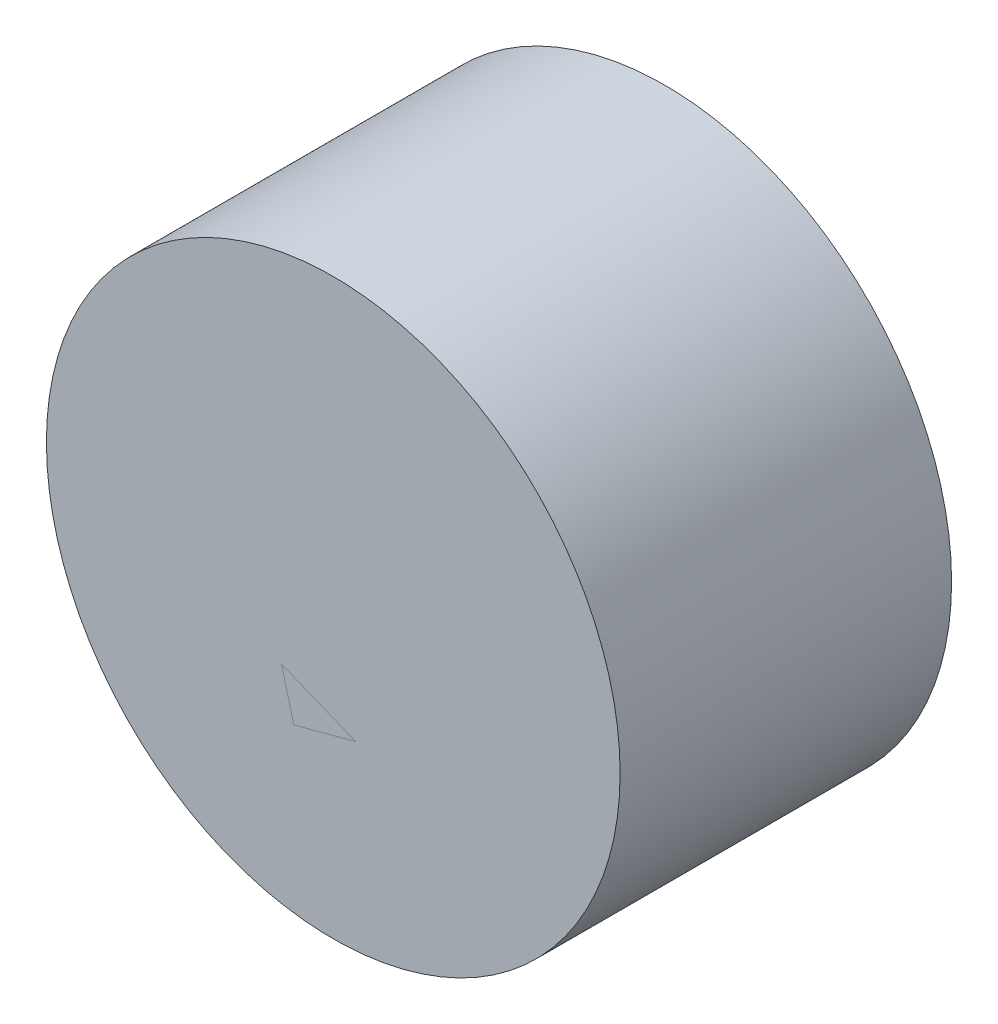
ISO-10303-21;
HEADER;
FILE_DESCRIPTION(('STEP AP214'),'2;1');
FILE_NAME('part.step','',(''),(''),'','','');
FILE_SCHEMA(('AUTOMOTIVE_DESIGN { 1 0 10303 214 1 1 1 1 }'));
ENDSEC;
DATA;
#1=APPLICATION_CONTEXT('core data for automotive mechanical design processes');
#2=APPLICATION_PROTOCOL_DEFINITION('international standard','automotive_design',2000,#1);
#3=PRODUCT_CONTEXT('',#1,'mechanical');
#4=PRODUCT('Part','Part','',(#3));
#5=PRODUCT_RELATED_PRODUCT_CATEGORY('part','',(#4));
#6=PRODUCT_DEFINITION_FORMATION('','',#4);
#7=PRODUCT_DEFINITION_CONTEXT('part definition',#1,'design');
#8=PRODUCT_DEFINITION('design','',#6,#7);
#9=PRODUCT_DEFINITION_SHAPE('','',#8);
#10=(LENGTH_UNIT() NAMED_UNIT(*) SI_UNIT(.MILLI.,.METRE.));
#11=(NAMED_UNIT(*) PLANE_ANGLE_UNIT() SI_UNIT($,.RADIAN.));
#12=(NAMED_UNIT(*) SI_UNIT($,.STERADIAN.) SOLID_ANGLE_UNIT());
#13=UNCERTAINTY_MEASURE_WITH_UNIT(LENGTH_MEASURE(1.E-05),#10,'distance_accuracy_value','');
#14=(GEOMETRIC_REPRESENTATION_CONTEXT(3) GLOBAL_UNCERTAINTY_ASSIGNED_CONTEXT((#13)) GLOBAL_UNIT_ASSIGNED_CONTEXT((#10,
#11,#12)) REPRESENTATION_CONTEXT('',''));
#15=CARTESIAN_POINT('',(0.,0.,0.));
#16=DIRECTION('',(0.,0.,1.));
#17=DIRECTION('',(1.,0.,0.));
#18=AXIS2_PLACEMENT_3D('',#15,#16,#17);
#19=CARTESIAN_POINT('',(-67.8886051914221,-34.8373245008687,4.5));
#20=DIRECTION('',(-0.921643821760074,-0.388036938720381,0.));
#21=DIRECTION('',(0.388036938720381,-0.921643821760074,0.));
#22=AXIS2_PLACEMENT_3D('',#19,#20,#21);
#23=PLANE('',#22);
#24=DIRECTION('',(0.388036938720381,-0.921643821760074,0.));
#25=VECTOR('',#24,1.);
#26=CARTESIAN_POINT('',(-67.8886051914221,-34.8373245008687,13.));
#27=LINE('',#26,#25);
#28=CARTESIAN_POINT('',(-68.3568110489924,-33.7252679081005,13.));
#29=VERTEX_POINT('',#28);
#30=CARTESIAN_POINT('',(-67.8886051914221,-34.8373245008687,13.));
#31=VERTEX_POINT('',#30);
#32=EDGE_CURVE('E108',#29,#31,#27,.T.);
#33=ORIENTED_EDGE('',*,*,#32,.F.);
#34=DIRECTION('',(0.,0.,1.));
#35=VECTOR('',#34,1.);
#36=CARTESIAN_POINT('',(-68.3568110489924,-33.7252679081005,4.5));
#37=LINE('',#36,#35);
#38=CARTESIAN_POINT('',(-68.3568110489924,-33.7252679081005,4.5));
#39=VERTEX_POINT('',#38);
#40=EDGE_CURVE('E12',#39,#29,#37,.T.);
#41=ORIENTED_EDGE('',*,*,#40,.F.);
#42=DIRECTION('',(0.388036938720381,-0.921643821760074,0.));
#43=VECTOR('',#42,1.);
#44=CARTESIAN_POINT('',(-67.8886051914221,-34.8373245008687,4.5));
#45=LINE('',#44,#43);
#46=CARTESIAN_POINT('',(-67.8886051914221,-34.8373245008687,4.5));
#47=VERTEX_POINT('',#46);
#48=EDGE_CURVE('E102',#39,#47,#45,.T.);
#49=ORIENTED_EDGE('',*,*,#48,.T.);
#50=DIRECTION('',(0.,0.,1.));
#51=VECTOR('',#50,1.);
#52=CARTESIAN_POINT('',(-67.8886051914221,-34.8373245008687,4.5));
#53=LINE('',#52,#51);
#54=EDGE_CURVE('E47',#47,#31,#53,.T.);
#55=ORIENTED_EDGE('',*,*,#54,.T.);
#56=EDGE_LOOP('',(#33,#41,#49,#55));
#57=FACE_BOUND('',#56,.T.);
#58=ADVANCED_FACE('F44',(#57),#23,.T.);
#59=CARTESIAN_POINT('',(-62.9737740037809,-32.0963081220779,4.5));
#60=DIRECTION('',(-0.289638748986839,0.957136037920075,0.));
#61=DIRECTION('',(-0.957136037920075,-0.289638748986839,0.));
#62=AXIS2_PLACEMENT_3D('',#59,#60,#61);
#63=PLANE('',#62);
#64=DIRECTION('',(-0.957136037920075,-0.289638748986839,0.));
#65=VECTOR('',#64,1.);
#66=CARTESIAN_POINT('',(-62.9737740037809,-32.0963081220779,13.));
#67=LINE('',#66,#65);
#68=CARTESIAN_POINT('',(-62.9737740037809,-32.0963081220779,13.));
#69=VERTEX_POINT('',#68);
#70=EDGE_CURVE('E104',#69,#29,#67,.T.);
#71=ORIENTED_EDGE('',*,*,#70,.F.);
#72=DIRECTION('',(0.,0.,1.));
#73=VECTOR('',#72,1.);
#74=CARTESIAN_POINT('',(-62.9737740037809,-32.0963081220779,4.5));
#75=LINE('',#74,#73);
#76=CARTESIAN_POINT('',(-62.9737740037809,-32.0963081220779,4.5));
#77=VERTEX_POINT('',#76);
#78=EDGE_CURVE('E53',#77,#69,#75,.T.);
#79=ORIENTED_EDGE('',*,*,#78,.F.);
#80=DIRECTION('',(-0.957136037920075,-0.289638748986839,0.));
#81=VECTOR('',#80,1.);
#82=CARTESIAN_POINT('',(-62.9737740037809,-32.0963081220779,4.5));
#83=LINE('',#82,#81);
#84=EDGE_CURVE('E99',#77,#39,#83,.T.);
#85=ORIENTED_EDGE('',*,*,#84,.T.);
#86=ORIENTED_EDGE('',*,*,#40,.T.);
#87=EDGE_LOOP('',(#71,#79,#85,#86));
#88=FACE_BOUND('',#87,.T.);
#89=ADVANCED_FACE('F118',(#88),#63,.T.);
#90=CARTESIAN_POINT('',(-62.6437364065095,-33.2501757850287,4.5));
#91=DIRECTION('',(0.961444424357765,0.274999307037975,0.));
#92=DIRECTION('',(-0.274999307037975,0.961444424357765,0.));
#93=AXIS2_PLACEMENT_3D('',#90,#91,#92);
#94=PLANE('',#93);
#95=DIRECTION('',(-0.274999307037975,0.961444424357765,0.));
#96=VECTOR('',#95,1.);
#97=CARTESIAN_POINT('',(-62.6437364065095,-33.2501757850287,13.));
#98=LINE('',#97,#96);
#99=CARTESIAN_POINT('',(-62.6437364065095,-33.2501757850287,13.));
#100=VERTEX_POINT('',#99);
#101=EDGE_CURVE('E94',#100,#69,#98,.T.);
#102=ORIENTED_EDGE('',*,*,#101,.F.);
#103=DIRECTION('',(0.,0.,1.));
#104=VECTOR('',#103,1.);
#105=CARTESIAN_POINT('',(-62.6437364065095,-33.2501757850287,4.5));
#106=LINE('',#105,#104);
#107=CARTESIAN_POINT('',(-62.6437364065095,-33.2501757850287,4.5));
#108=VERTEX_POINT('',#107);
#109=EDGE_CURVE('E89',#108,#100,#106,.T.);
#110=ORIENTED_EDGE('',*,*,#109,.F.);
#111=DIRECTION('',(-0.274999307037975,0.961444424357765,0.));
#112=VECTOR('',#111,1.);
#113=CARTESIAN_POINT('',(-62.6437364065095,-33.2501757850287,4.5));
#114=LINE('',#113,#112);
#115=EDGE_CURVE('E92',#108,#77,#114,.T.);
#116=ORIENTED_EDGE('',*,*,#115,.T.);
#117=ORIENTED_EDGE('',*,*,#78,.T.);
#118=EDGE_LOOP('',(#102,#110,#116,#117));
#119=FACE_BOUND('',#118,.T.);
#120=ADVANCED_FACE('F91',(#119),#94,.T.);
#121=CARTESIAN_POINT('',(-67.8886051914221,-34.8373245008687,4.5));
#122=DIRECTION('',(0.289638748988038,-0.957136037919712,0.));
#123=DIRECTION('',(0.957136037919712,0.289638748988038,0.));
#124=AXIS2_PLACEMENT_3D('',#121,#122,#123);
#125=PLANE('',#124);
#126=DIRECTION('',(0.957136037919712,0.289638748988038,0.));
#127=VECTOR('',#126,1.);
#128=CARTESIAN_POINT('',(-67.8886051914221,-34.8373245008687,13.));
#129=LINE('',#128,#127);
#130=EDGE_CURVE('E111',#31,#100,#129,.T.);
#131=ORIENTED_EDGE('',*,*,#130,.F.);
#132=ORIENTED_EDGE('',*,*,#54,.F.);
#133=DIRECTION('',(0.957136037919712,0.289638748988038,0.));
#134=VECTOR('',#133,1.);
#135=CARTESIAN_POINT('',(-67.8886051914221,-34.8373245008687,4.5));
#136=LINE('',#135,#134);
#137=EDGE_CURVE('E98',#47,#108,#136,.T.);
#138=ORIENTED_EDGE('',*,*,#137,.T.);
#139=ORIENTED_EDGE('',*,*,#109,.T.);
#140=EDGE_LOOP('',(#131,#132,#138,#139));
#141=FACE_BOUND('',#140,.T.);
#142=ADVANCED_FACE('F101',(#141),#125,.T.);
#143=CARTESIAN_POINT('',(0.,0.,4.5));
#144=DIRECTION('',(0.,0.,1.));
#145=DIRECTION('',(1.,0.,0.));
#146=AXIS2_PLACEMENT_3D('',#143,#144,#145);
#147=PLANE('',#146);
#148=ORIENTED_EDGE('',*,*,#48,.F.);
#149=ORIENTED_EDGE('',*,*,#84,.F.);
#150=ORIENTED_EDGE('',*,*,#115,.F.);
#151=ORIENTED_EDGE('',*,*,#137,.F.);
#152=EDGE_LOOP('',(#148,#149,#150,#151));
#153=FACE_BOUND('',#152,.T.);
#154=ADVANCED_FACE('F97',(#153),#147,.F.);
#155=CARTESIAN_POINT('',(0.,0.,13.));
#156=DIRECTION('',(0.,0.,1.));
#157=DIRECTION('',(1.,0.,0.));
#158=AXIS2_PLACEMENT_3D('',#155,#156,#157);
#159=PLANE('',#158);
#160=ORIENTED_EDGE('',*,*,#32,.T.);
#161=ORIENTED_EDGE('',*,*,#130,.T.);
#162=ORIENTED_EDGE('',*,*,#101,.T.);
#163=ORIENTED_EDGE('',*,*,#70,.T.);
#164=EDGE_LOOP('',(#160,#161,#162,#163));
#165=FACE_BOUND('',#164,.T.);
#166=ADVANCED_FACE('F117',(#165),#159,.T.);
#167=CLOSED_SHELL('',(#58,#89,#120,#142,#154,#166));
#168=MANIFOLD_SOLID_BREP('B2',#167);
#169=CARTESIAN_POINT('',(-65.3939636141081,-33.4555513638988,13.));
#170=DIRECTION('',(0.,0.,-1.));
#171=DIRECTION('',(-1.,0.,0.));
#172=AXIS2_PLACEMENT_3D('',#169,#170,#171);
#173=CYLINDRICAL_SURFACE('',#172,5.);
#174=CARTESIAN_POINT('',(-65.3939636141081,-33.4555513638988,13.));
#175=DIRECTION('',(0.,0.,1.));
#176=DIRECTION('',(1.,0.,0.));
#177=AXIS2_PLACEMENT_3D('',#174,#175,#176);
#178=CIRCLE('',#177,5.);
#179=CARTESIAN_POINT('',(-70.3939636141081,-33.4555513638988,13.));
#180=VERTEX_POINT('',#179);
#181=EDGE_CURVE('E43',#180,#180,#178,.T.);
#182=CARTESIAN_POINT('',(-65.3939636141081,-33.4555513638988,0.));
#183=DIRECTION('',(0.,0.,1.));
#184=DIRECTION('',(1.,0.,0.));
#185=AXIS2_PLACEMENT_3D('',#182,#183,#184);
#186=CIRCLE('',#185,5.);
#187=CARTESIAN_POINT('',(-70.3939636141081,-33.4555513638988,0.));
#188=VERTEX_POINT('',#187);
#189=EDGE_CURVE('E178',#188,#188,#186,.T.);
#190=CARTESIAN_POINT('',(-70.3939636141081,-33.4555513638988,13.));
#191=CARTESIAN_POINT('',(-70.3939636141081,-33.4555513638988,12.8645833333333));
#192=CARTESIAN_POINT('',(-70.3939636141081,-33.4555513638988,12.7291666666667));
#193=CARTESIAN_POINT('',(-70.3939636141081,-33.4555513638988,12.4583333333333));
#194=CARTESIAN_POINT('',(-70.3939636141081,-33.4555513638988,12.3229166666667));
#195=CARTESIAN_POINT('',(-70.3939636141081,-33.4555513638988,12.0520833333333));
#196=CARTESIAN_POINT('',(-70.3939636141081,-33.4555513638988,11.9166666666667));
#197=CARTESIAN_POINT('',(-70.3939636141081,-33.4555513638988,11.6458333333333));
#198=CARTESIAN_POINT('',(-70.3939636141081,-33.4555513638988,11.5104166666667));
#199=CARTESIAN_POINT('',(-70.3939636141081,-33.4555513638988,11.2395833333333));
#200=CARTESIAN_POINT('',(-70.3939636141081,-33.4555513638988,11.1041666666667));
#201=CARTESIAN_POINT('',(-70.3939636141081,-33.4555513638988,10.8333333333333));
#202=CARTESIAN_POINT('',(-70.3939636141081,-33.4555513638988,10.6979166666667));
#203=CARTESIAN_POINT('',(-70.3939636141081,-33.4555513638988,10.4270833333333));
#204=CARTESIAN_POINT('',(-70.3939636141081,-33.4555513638988,10.2916666666667));
#205=CARTESIAN_POINT('',(-70.3939636141081,-33.4555513638988,10.0208333333333));
#206=CARTESIAN_POINT('',(-70.3939636141081,-33.4555513638988,9.88541666666667));
#207=CARTESIAN_POINT('',(-70.3939636141081,-33.4555513638988,9.61458333333333));
#208=CARTESIAN_POINT('',(-70.3939636141081,-33.4555513638988,9.47916666666667));
#209=CARTESIAN_POINT('',(-70.3939636141081,-33.4555513638988,9.20833333333333));
#210=CARTESIAN_POINT('',(-70.3939636141081,-33.4555513638988,9.07291666666667));
#211=CARTESIAN_POINT('',(-70.3939636141081,-33.4555513638988,8.80208333333333));
#212=CARTESIAN_POINT('',(-70.3939636141081,-33.4555513638988,8.66666666666667));
#213=CARTESIAN_POINT('',(-70.3939636141081,-33.4555513638988,8.39583333333333));
#214=CARTESIAN_POINT('',(-70.3939636141081,-33.4555513638988,8.26041666666667));
#215=CARTESIAN_POINT('',(-70.3939636141081,-33.4555513638988,7.98958333333333));
#216=CARTESIAN_POINT('',(-70.3939636141081,-33.4555513638988,7.85416666666667));
#217=CARTESIAN_POINT('',(-70.3939636141081,-33.4555513638988,7.58333333333333));
#218=CARTESIAN_POINT('',(-70.3939636141081,-33.4555513638988,7.44791666666667));
#219=CARTESIAN_POINT('',(-70.3939636141081,-33.4555513638988,7.17708333333333));
#220=CARTESIAN_POINT('',(-70.3939636141081,-33.4555513638988,7.04166666666667));
#221=CARTESIAN_POINT('',(-70.3939636141081,-33.4555513638988,6.77083333333333));
#222=CARTESIAN_POINT('',(-70.3939636141081,-33.4555513638988,6.63541666666667));
#223=CARTESIAN_POINT('',(-70.3939636141081,-33.4555513638988,6.36458333333333));
#224=CARTESIAN_POINT('',(-70.3939636141081,-33.4555513638988,6.22916666666667));
#225=CARTESIAN_POINT('',(-70.3939636141081,-33.4555513638988,5.95833333333333));
#226=CARTESIAN_POINT('',(-70.3939636141081,-33.4555513638988,5.82291666666667));
#227=CARTESIAN_POINT('',(-70.3939636141081,-33.4555513638988,5.55208333333333));
#228=CARTESIAN_POINT('',(-70.3939636141081,-33.4555513638988,5.41666666666667));
#229=CARTESIAN_POINT('',(-70.3939636141081,-33.4555513638988,5.14583333333333));
#230=CARTESIAN_POINT('',(-70.3939636141081,-33.4555513638988,5.01041666666667));
#231=CARTESIAN_POINT('',(-70.3939636141081,-33.4555513638988,4.73958333333333));
#232=CARTESIAN_POINT('',(-70.3939636141081,-33.4555513638988,4.60416666666667));
#233=CARTESIAN_POINT('',(-70.3939636141081,-33.4555513638988,4.33333333333333));
#234=CARTESIAN_POINT('',(-70.3939636141081,-33.4555513638988,4.19791666666667));
#235=CARTESIAN_POINT('',(-70.3939636141081,-33.4555513638988,3.92708333333333));
#236=CARTESIAN_POINT('',(-70.3939636141081,-33.4555513638988,3.79166666666667));
#237=CARTESIAN_POINT('',(-70.3939636141081,-33.4555513638988,3.52083333333333));
#238=CARTESIAN_POINT('',(-70.3939636141081,-33.4555513638988,3.38541666666667));
#239=CARTESIAN_POINT('',(-70.3939636141081,-33.4555513638988,3.11458333333333));
#240=CARTESIAN_POINT('',(-70.3939636141081,-33.4555513638988,2.97916666666667));
#241=CARTESIAN_POINT('',(-70.3939636141081,-33.4555513638988,2.70833333333333));
#242=CARTESIAN_POINT('',(-70.3939636141081,-33.4555513638988,2.57291666666667));
#243=CARTESIAN_POINT('',(-70.3939636141081,-33.4555513638988,2.30208333333333));
#244=CARTESIAN_POINT('',(-70.3939636141081,-33.4555513638988,2.16666666666667));
#245=CARTESIAN_POINT('',(-70.3939636141081,-33.4555513638988,1.89583333333333));
#246=CARTESIAN_POINT('',(-70.3939636141081,-33.4555513638988,1.76041666666667));
#247=CARTESIAN_POINT('',(-70.3939636141081,-33.4555513638988,1.48958333333333));
#248=CARTESIAN_POINT('',(-70.3939636141081,-33.4555513638988,1.35416666666667));
#249=CARTESIAN_POINT('',(-70.3939636141081,-33.4555513638988,1.08333333333333));
#250=CARTESIAN_POINT('',(-70.3939636141081,-33.4555513638988,0.947916666666667));
#251=CARTESIAN_POINT('',(-70.3939636141081,-33.4555513638988,0.677083333333334));
#252=CARTESIAN_POINT('',(-70.3939636141081,-33.4555513638988,0.541666666666667));
#253=CARTESIAN_POINT('',(-70.3939636141081,-33.4555513638988,0.270833333333334));
#254=CARTESIAN_POINT('',(-70.3939636141081,-33.4555513638988,0.135416666666667));
#255=CARTESIAN_POINT('',(-70.3939636141081,-33.4555513638988,0.));
#256=B_SPLINE_CURVE_WITH_KNOTS('',3,(#190,#191,#192,#193,#194,#195,#196,#197,#198,#199,#200,
#201,#202,#203,#204,#205,#206,#207,#208,#209,#210,#211,#212,#213,#214,#215,#216,#217,#218,#219,
#220,#221,#222,#223,#224,#225,#226,#227,#228,#229,#230,#231,#232,#233,#234,#235,#236,#237,#238,
#239,#240,#241,#242,#243,#244,#245,#246,#247,#248,#249,#250,#251,#252,#253,#254,#255),
.UNSPECIFIED.,.F.,.F.,(4,2,2,2,2,2,2,2,2,2,2,2,2,2,2,2,2,2,2,2,2,2,2,2,2,2,2,2,2,2,2,2,4),(0.,
0.406249999999999,0.812499999999999,1.21875,1.625,2.03125,2.4375,2.84375,3.25,3.65625,4.0625,
4.46875,4.875,5.28125,5.6875,6.09375,6.5,6.90625,7.3125,7.71875,8.125,8.53125,8.9375,9.34375,
9.75,10.15625,10.5625,10.96875,11.375,11.78125,12.1875,12.59375,13.),.UNSPECIFIED.);
#257=EDGE_CURVE('BSEAM175',#180,#188,#256,.T.);
#258=ORIENTED_EDGE('',*,*,#181,.F.);
#259=ORIENTED_EDGE('',*,*,#189,.T.);
#260=ORIENTED_EDGE('',*,*,#257,.T.);
#261=ORIENTED_EDGE('',*,*,#257,.F.);
#262=EDGE_LOOP('',(#258,#260,#259,#261));
#263=FACE_BOUND('',#262,.T.);
#264=ADVANCED_FACE('F175',(#263),#173,.T.);
#265=CARTESIAN_POINT('',(-65.3939636141081,-33.4555513638988,13.));
#266=DIRECTION('',(0.,0.,1.));
#267=DIRECTION('',(1.,0.,0.));
#268=AXIS2_PLACEMENT_3D('',#265,#266,#267);
#269=PLANE('',#268);
#270=ORIENTED_EDGE('',*,*,#181,.T.);
#271=EDGE_LOOP('',(#270));
#272=FACE_BOUND('',#271,.T.);
#273=ADVANCED_FACE('F206',(#272),#269,.T.);
#274=CARTESIAN_POINT('',(-65.3939636141081,-33.4555513638988,0.));
#275=DIRECTION('',(0.,0.,1.));
#276=DIRECTION('',(1.,0.,0.));
#277=AXIS2_PLACEMENT_3D('',#274,#275,#276);
#278=PLANE('',#277);
#279=CARTESIAN_POINT('',(-65.3939636141081,-33.4555513638988,0.));
#280=DIRECTION('',(0.,0.,1.));
#281=DIRECTION('',(1.,0.,0.));
#282=AXIS2_PLACEMENT_3D('',#279,#280,#281);
#283=CIRCLE('',#282,4.);
#284=CARTESIAN_POINT('',(-69.3939636141081,-33.4555513638988,0.));
#285=VERTEX_POINT('',#284);
#286=EDGE_CURVE('E187',#285,#285,#283,.T.);
#287=ORIENTED_EDGE('',*,*,#286,.T.);
#288=EDGE_LOOP('',(#287));
#289=FACE_BOUND('',#288,.T.);
#290=ORIENTED_EDGE('',*,*,#189,.F.);
#291=EDGE_LOOP('',(#290));
#292=FACE_BOUND('',#291,.T.);
#293=ADVANCED_FACE('F202',(#289,#292),#278,.F.);
#294=CARTESIAN_POINT('',(-65.3939636141081,-33.4555513638988,13.));
#295=DIRECTION('',(0.,0.,-1.));
#296=DIRECTION('',(-1.,0.,0.));
#297=AXIS2_PLACEMENT_3D('',#294,#295,#296);
#298=CYLINDRICAL_SURFACE('',#297,4.);
#299=CARTESIAN_POINT('',(-65.3939636141081,-33.4555513638988,12.));
#300=DIRECTION('',(0.,0.,1.));
#301=DIRECTION('',(1.,0.,0.));
#302=AXIS2_PLACEMENT_3D('',#299,#300,#301);
#303=CIRCLE('',#302,4.);
#304=CARTESIAN_POINT('',(-69.3939636141081,-33.4555513638988,12.));
#305=VERTEX_POINT('',#304);
#306=EDGE_CURVE('E185',#305,#305,#303,.T.);
#307=CARTESIAN_POINT('',(-69.3939636141081,-33.4555513638988,12.));
#308=CARTESIAN_POINT('',(-69.3939636141081,-33.4555513638988,11.875));
#309=CARTESIAN_POINT('',(-69.3939636141081,-33.4555513638988,11.75));
#310=CARTESIAN_POINT('',(-69.3939636141081,-33.4555513638988,11.5));
#311=CARTESIAN_POINT('',(-69.3939636141081,-33.4555513638988,11.375));
#312=CARTESIAN_POINT('',(-69.3939636141081,-33.4555513638988,11.125));
#313=CARTESIAN_POINT('',(-69.3939636141081,-33.4555513638988,11.));
#314=CARTESIAN_POINT('',(-69.3939636141081,-33.4555513638988,10.75));
#315=CARTESIAN_POINT('',(-69.3939636141081,-33.4555513638988,10.625));
#316=CARTESIAN_POINT('',(-69.3939636141081,-33.4555513638988,10.375));
#317=CARTESIAN_POINT('',(-69.3939636141081,-33.4555513638988,10.25));
#318=CARTESIAN_POINT('',(-69.3939636141081,-33.4555513638988,10.));
#319=CARTESIAN_POINT('',(-69.3939636141081,-33.4555513638988,9.875));
#320=CARTESIAN_POINT('',(-69.3939636141081,-33.4555513638988,9.625));
#321=CARTESIAN_POINT('',(-69.3939636141081,-33.4555513638988,9.5));
#322=CARTESIAN_POINT('',(-69.3939636141081,-33.4555513638988,9.25));
#323=CARTESIAN_POINT('',(-69.3939636141081,-33.4555513638988,9.125));
#324=CARTESIAN_POINT('',(-69.3939636141081,-33.4555513638988,8.875));
#325=CARTESIAN_POINT('',(-69.3939636141081,-33.4555513638988,8.75));
#326=CARTESIAN_POINT('',(-69.3939636141081,-33.4555513638988,8.5));
#327=CARTESIAN_POINT('',(-69.3939636141081,-33.4555513638988,8.375));
#328=CARTESIAN_POINT('',(-69.3939636141081,-33.4555513638988,8.125));
#329=CARTESIAN_POINT('',(-69.3939636141081,-33.4555513638988,8.));
#330=CARTESIAN_POINT('',(-69.3939636141081,-33.4555513638988,7.75));
#331=CARTESIAN_POINT('',(-69.3939636141081,-33.4555513638988,7.625));
#332=CARTESIAN_POINT('',(-69.3939636141081,-33.4555513638988,7.375));
#333=CARTESIAN_POINT('',(-69.3939636141081,-33.4555513638988,7.25));
#334=CARTESIAN_POINT('',(-69.3939636141081,-33.4555513638988,7.));
#335=CARTESIAN_POINT('',(-69.3939636141081,-33.4555513638988,6.875));
#336=CARTESIAN_POINT('',(-69.3939636141081,-33.4555513638988,6.625));
#337=CARTESIAN_POINT('',(-69.3939636141081,-33.4555513638988,6.5));
#338=CARTESIAN_POINT('',(-69.3939636141081,-33.4555513638988,6.25));
#339=CARTESIAN_POINT('',(-69.3939636141081,-33.4555513638988,6.125));
#340=CARTESIAN_POINT('',(-69.3939636141081,-33.4555513638988,5.875));
#341=CARTESIAN_POINT('',(-69.3939636141081,-33.4555513638988,5.75));
#342=CARTESIAN_POINT('',(-69.3939636141081,-33.4555513638988,5.5));
#343=CARTESIAN_POINT('',(-69.3939636141081,-33.4555513638988,5.375));
#344=CARTESIAN_POINT('',(-69.3939636141081,-33.4555513638988,5.125));
#345=CARTESIAN_POINT('',(-69.3939636141081,-33.4555513638988,5.));
#346=CARTESIAN_POINT('',(-69.3939636141081,-33.4555513638988,4.75));
#347=CARTESIAN_POINT('',(-69.3939636141081,-33.4555513638988,4.625));
#348=CARTESIAN_POINT('',(-69.3939636141081,-33.4555513638988,4.375));
#349=CARTESIAN_POINT('',(-69.3939636141081,-33.4555513638988,4.25));
#350=CARTESIAN_POINT('',(-69.3939636141081,-33.4555513638988,4.));
#351=CARTESIAN_POINT('',(-69.3939636141081,-33.4555513638988,3.875));
#352=CARTESIAN_POINT('',(-69.3939636141081,-33.4555513638988,3.625));
#353=CARTESIAN_POINT('',(-69.3939636141081,-33.4555513638988,3.5));
#354=CARTESIAN_POINT('',(-69.3939636141081,-33.4555513638988,3.25));
#355=CARTESIAN_POINT('',(-69.3939636141081,-33.4555513638988,3.125));
#356=CARTESIAN_POINT('',(-69.3939636141081,-33.4555513638988,2.875));
#357=CARTESIAN_POINT('',(-69.3939636141081,-33.4555513638988,2.75));
#358=CARTESIAN_POINT('',(-69.3939636141081,-33.4555513638988,2.5));
#359=CARTESIAN_POINT('',(-69.3939636141081,-33.4555513638988,2.375));
#360=CARTESIAN_POINT('',(-69.3939636141081,-33.4555513638988,2.125));
#361=CARTESIAN_POINT('',(-69.3939636141081,-33.4555513638988,2.));
#362=CARTESIAN_POINT('',(-69.3939636141081,-33.4555513638988,1.75));
#363=CARTESIAN_POINT('',(-69.3939636141081,-33.4555513638988,1.625));
#364=CARTESIAN_POINT('',(-69.3939636141081,-33.4555513638988,1.375));
#365=CARTESIAN_POINT('',(-69.3939636141081,-33.4555513638988,1.25));
#366=CARTESIAN_POINT('',(-69.3939636141081,-33.4555513638988,1.));
#367=CARTESIAN_POINT('',(-69.3939636141081,-33.4555513638988,0.875));
#368=CARTESIAN_POINT('',(-69.3939636141081,-33.4555513638988,0.625000000000001));
#369=CARTESIAN_POINT('',(-69.3939636141081,-33.4555513638988,0.5));
#370=CARTESIAN_POINT('',(-69.3939636141081,-33.4555513638988,0.25));
#371=CARTESIAN_POINT('',(-69.3939636141081,-33.4555513638988,0.125));
#372=CARTESIAN_POINT('',(-69.3939636141081,-33.4555513638988,0.));
#373=B_SPLINE_CURVE_WITH_KNOTS('',3,(#307,#308,#309,#310,#311,#312,#313,#314,#315,#316,#317,
#318,#319,#320,#321,#322,#323,#324,#325,#326,#327,#328,#329,#330,#331,#332,#333,#334,#335,#336,
#337,#338,#339,#340,#341,#342,#343,#344,#345,#346,#347,#348,#349,#350,#351,#352,#353,#354,#355,
#356,#357,#358,#359,#360,#361,#362,#363,#364,#365,#366,#367,#368,#369,#370,#371,#372),
.UNSPECIFIED.,.F.,.F.,(4,2,2,2,2,2,2,2,2,2,2,2,2,2,2,2,2,2,2,2,2,2,2,2,2,2,2,2,2,2,2,2,4),(0.,
0.374999999999999,0.749999999999999,1.125,1.5,1.875,2.25,2.625,3.,3.375,3.75,4.125,4.5,4.875,
5.25,5.625,6.,6.375,6.75,7.125,7.5,7.875,8.25,8.625,9.,9.375,9.75,10.125,10.5,10.875,11.25,
11.625,12.),.UNSPECIFIED.);
#374=EDGE_CURVE('BSEAM193',#305,#285,#373,.T.);
#375=ORIENTED_EDGE('',*,*,#306,.T.);
#376=ORIENTED_EDGE('',*,*,#286,.F.);
#377=ORIENTED_EDGE('',*,*,#374,.T.);
#378=ORIENTED_EDGE('',*,*,#374,.F.);
#379=EDGE_LOOP('',(#375,#377,#376,#378));
#380=FACE_BOUND('',#379,.T.);
#381=ADVANCED_FACE('F193',(#380),#298,.F.);
#382=CARTESIAN_POINT('',(-65.3939636141081,-33.4555513638988,12.));
#383=DIRECTION('',(0.,0.,1.));
#384=DIRECTION('',(1.,0.,0.));
#385=AXIS2_PLACEMENT_3D('',#382,#383,#384);
#386=PLANE('',#385);
#387=ORIENTED_EDGE('',*,*,#306,.F.);
#388=EDGE_LOOP('',(#387));
#389=FACE_BOUND('',#388,.T.);
#390=ADVANCED_FACE('F196',(#389),#386,.F.);
#391=CLOSED_SHELL('',(#264,#273,#293,#381,#390));
#392=MANIFOLD_SOLID_BREP('B6',#391);
#393=CARTESIAN_POINT('',(-65.3939636141076,-33.4555513638986,13.));
#394=DIRECTION('',(0.,0.,-1.));
#395=DIRECTION('',(-1.,0.,0.));
#396=AXIS2_PLACEMENT_3D('',#393,#394,#395);
#397=CYLINDRICAL_SURFACE('',#396,11.25);
#398=CARTESIAN_POINT('',(-65.3939636141076,-33.4555513638986,13.));
#399=DIRECTION('',(0.,0.,1.));
#400=DIRECTION('',(1.,0.,0.));
#401=AXIS2_PLACEMENT_3D('',#398,#399,#400);
#402=CIRCLE('',#401,11.25);
#403=CARTESIAN_POINT('',(-76.6439636141076,-33.4555513638986,13.));
#404=VERTEX_POINT('',#403);
#405=EDGE_CURVE('E174',#404,#404,#402,.T.);
#406=CARTESIAN_POINT('',(-65.3939636141076,-33.4555513638986,0.));
#407=DIRECTION('',(0.,0.,1.));
#408=DIRECTION('',(1.,0.,0.));
#409=AXIS2_PLACEMENT_3D('',#406,#407,#408);
#410=CIRCLE('',#409,11.25);
#411=CARTESIAN_POINT('',(-76.6439636141076,-33.4555513638986,0.));
#412=VERTEX_POINT('',#411);
#413=EDGE_CURVE('E249',#412,#412,#410,.T.);
#414=CARTESIAN_POINT('',(-76.6439636141076,-33.4555513638986,13.));
#415=CARTESIAN_POINT('',(-76.6439636141076,-33.4555513638986,12.8645833333333));
#416=CARTESIAN_POINT('',(-76.6439636141076,-33.4555513638986,12.7291666666667));
#417=CARTESIAN_POINT('',(-76.6439636141076,-33.4555513638986,12.4583333333333));
#418=CARTESIAN_POINT('',(-76.6439636141076,-33.4555513638986,12.3229166666667));
#419=CARTESIAN_POINT('',(-76.6439636141076,-33.4555513638986,12.0520833333333));
#420=CARTESIAN_POINT('',(-76.6439636141076,-33.4555513638986,11.9166666666667));
#421=CARTESIAN_POINT('',(-76.6439636141076,-33.4555513638986,11.6458333333333));
#422=CARTESIAN_POINT('',(-76.6439636141076,-33.4555513638986,11.5104166666667));
#423=CARTESIAN_POINT('',(-76.6439636141076,-33.4555513638986,11.2395833333333));
#424=CARTESIAN_POINT('',(-76.6439636141076,-33.4555513638986,11.1041666666667));
#425=CARTESIAN_POINT('',(-76.6439636141076,-33.4555513638986,10.8333333333333));
#426=CARTESIAN_POINT('',(-76.6439636141076,-33.4555513638986,10.6979166666667));
#427=CARTESIAN_POINT('',(-76.6439636141076,-33.4555513638986,10.4270833333333));
#428=CARTESIAN_POINT('',(-76.6439636141076,-33.4555513638986,10.2916666666667));
#429=CARTESIAN_POINT('',(-76.6439636141076,-33.4555513638986,10.0208333333333));
#430=CARTESIAN_POINT('',(-76.6439636141076,-33.4555513638986,9.88541666666667));
#431=CARTESIAN_POINT('',(-76.6439636141076,-33.4555513638986,9.61458333333333));
#432=CARTESIAN_POINT('',(-76.6439636141076,-33.4555513638986,9.47916666666667));
#433=CARTESIAN_POINT('',(-76.6439636141076,-33.4555513638986,9.20833333333333));
#434=CARTESIAN_POINT('',(-76.6439636141076,-33.4555513638986,9.07291666666667));
#435=CARTESIAN_POINT('',(-76.6439636141076,-33.4555513638986,8.80208333333333));
#436=CARTESIAN_POINT('',(-76.6439636141076,-33.4555513638986,8.66666666666667));
#437=CARTESIAN_POINT('',(-76.6439636141076,-33.4555513638986,8.39583333333333));
#438=CARTESIAN_POINT('',(-76.6439636141076,-33.4555513638986,8.26041666666667));
#439=CARTESIAN_POINT('',(-76.6439636141076,-33.4555513638986,7.98958333333333));
#440=CARTESIAN_POINT('',(-76.6439636141076,-33.4555513638986,7.85416666666667));
#441=CARTESIAN_POINT('',(-76.6439636141076,-33.4555513638986,7.58333333333333));
#442=CARTESIAN_POINT('',(-76.6439636141076,-33.4555513638986,7.44791666666667));
#443=CARTESIAN_POINT('',(-76.6439636141076,-33.4555513638986,7.17708333333333));
#444=CARTESIAN_POINT('',(-76.6439636141076,-33.4555513638986,7.04166666666667));
#445=CARTESIAN_POINT('',(-76.6439636141076,-33.4555513638986,6.77083333333333));
#446=CARTESIAN_POINT('',(-76.6439636141076,-33.4555513638986,6.63541666666667));
#447=CARTESIAN_POINT('',(-76.6439636141076,-33.4555513638986,6.36458333333333));
#448=CARTESIAN_POINT('',(-76.6439636141076,-33.4555513638986,6.22916666666667));
#449=CARTESIAN_POINT('',(-76.6439636141076,-33.4555513638986,5.95833333333333));
#450=CARTESIAN_POINT('',(-76.6439636141076,-33.4555513638986,5.82291666666667));
#451=CARTESIAN_POINT('',(-76.6439636141076,-33.4555513638986,5.55208333333333));
#452=CARTESIAN_POINT('',(-76.6439636141076,-33.4555513638986,5.41666666666667));
#453=CARTESIAN_POINT('',(-76.6439636141076,-33.4555513638986,5.14583333333333));
#454=CARTESIAN_POINT('',(-76.6439636141076,-33.4555513638986,5.01041666666667));
#455=CARTESIAN_POINT('',(-76.6439636141076,-33.4555513638986,4.73958333333333));
#456=CARTESIAN_POINT('',(-76.6439636141076,-33.4555513638986,4.60416666666667));
#457=CARTESIAN_POINT('',(-76.6439636141076,-33.4555513638986,4.33333333333333));
#458=CARTESIAN_POINT('',(-76.6439636141076,-33.4555513638986,4.19791666666667));
#459=CARTESIAN_POINT('',(-76.6439636141076,-33.4555513638986,3.92708333333333));
#460=CARTESIAN_POINT('',(-76.6439636141076,-33.4555513638986,3.79166666666667));
#461=CARTESIAN_POINT('',(-76.6439636141076,-33.4555513638986,3.52083333333333));
#462=CARTESIAN_POINT('',(-76.6439636141076,-33.4555513638986,3.38541666666667));
#463=CARTESIAN_POINT('',(-76.6439636141076,-33.4555513638986,3.11458333333333));
#464=CARTESIAN_POINT('',(-76.6439636141076,-33.4555513638986,2.97916666666667));
#465=CARTESIAN_POINT('',(-76.6439636141076,-33.4555513638986,2.70833333333333));
#466=CARTESIAN_POINT('',(-76.6439636141076,-33.4555513638986,2.57291666666667));
#467=CARTESIAN_POINT('',(-76.6439636141076,-33.4555513638986,2.30208333333333));
#468=CARTESIAN_POINT('',(-76.6439636141076,-33.4555513638986,2.16666666666667));
#469=CARTESIAN_POINT('',(-76.6439636141076,-33.4555513638986,1.89583333333333));
#470=CARTESIAN_POINT('',(-76.6439636141076,-33.4555513638986,1.76041666666667));
#471=CARTESIAN_POINT('',(-76.6439636141076,-33.4555513638986,1.48958333333333));
#472=CARTESIAN_POINT('',(-76.6439636141076,-33.4555513638986,1.35416666666667));
#473=CARTESIAN_POINT('',(-76.6439636141076,-33.4555513638986,1.08333333333333));
#474=CARTESIAN_POINT('',(-76.6439636141076,-33.4555513638986,0.947916666666667));
#475=CARTESIAN_POINT('',(-76.6439636141076,-33.4555513638986,0.677083333333334));
#476=CARTESIAN_POINT('',(-76.6439636141076,-33.4555513638986,0.541666666666667));
#477=CARTESIAN_POINT('',(-76.6439636141076,-33.4555513638986,0.270833333333334));
#478=CARTESIAN_POINT('',(-76.6439636141076,-33.4555513638986,0.135416666666667));
#479=CARTESIAN_POINT('',(-76.6439636141076,-33.4555513638986,0.));
#480=B_SPLINE_CURVE_WITH_KNOTS('',3,(#414,#415,#416,#417,#418,#419,#420,#421,#422,#423,#424,
#425,#426,#427,#428,#429,#430,#431,#432,#433,#434,#435,#436,#437,#438,#439,#440,#441,#442,#443,
#444,#445,#446,#447,#448,#449,#450,#451,#452,#453,#454,#455,#456,#457,#458,#459,#460,#461,#462,
#463,#464,#465,#466,#467,#468,#469,#470,#471,#472,#473,#474,#475,#476,#477,#478,#479),
.UNSPECIFIED.,.F.,.F.,(4,2,2,2,2,2,2,2,2,2,2,2,2,2,2,2,2,2,2,2,2,2,2,2,2,2,2,2,2,2,2,2,4),(0.,
0.406249999999999,0.812499999999999,1.21875,1.625,2.03125,2.4375,2.84375,3.25,3.65625,4.0625,
4.46875,4.875,5.28125,5.6875,6.09375,6.5,6.90625,7.3125,7.71875,8.125,8.53125,8.9375,9.34375,
9.75,10.15625,10.5625,10.96875,11.375,11.78125,12.1875,12.59375,13.),.UNSPECIFIED.);
#481=EDGE_CURVE('BSEAM246',#404,#412,#480,.T.);
#482=ORIENTED_EDGE('',*,*,#405,.F.);
#483=ORIENTED_EDGE('',*,*,#413,.T.);
#484=ORIENTED_EDGE('',*,*,#481,.T.);
#485=ORIENTED_EDGE('',*,*,#481,.F.);
#486=EDGE_LOOP('',(#482,#484,#483,#485));
#487=FACE_BOUND('',#486,.T.);
#488=ADVANCED_FACE('F246',(#487),#397,.T.);
#489=CARTESIAN_POINT('',(-65.3939636141076,-33.4555513638986,13.));
#490=DIRECTION('',(0.,0.,1.));
#491=DIRECTION('',(1.,0.,0.));
#492=AXIS2_PLACEMENT_3D('',#489,#490,#491);
#493=PLANE('',#492);
#494=ORIENTED_EDGE('',*,*,#405,.T.);
#495=EDGE_LOOP('',(#494));
#496=FACE_BOUND('',#495,.T.);
#497=ADVANCED_FACE('F277',(#496),#493,.T.);
#498=CARTESIAN_POINT('',(-65.3939636141076,-33.4555513638986,0.));
#499=DIRECTION('',(0.,0.,1.));
#500=DIRECTION('',(1.,0.,0.));
#501=AXIS2_PLACEMENT_3D('',#498,#499,#500);
#502=PLANE('',#501);
#503=CARTESIAN_POINT('',(-65.3939636141076,-33.4555513638986,0.));
#504=DIRECTION('',(0.,0.,1.));
#505=DIRECTION('',(1.,0.,0.));
#506=AXIS2_PLACEMENT_3D('',#503,#504,#505);
#507=CIRCLE('',#506,8.25);
#508=CARTESIAN_POINT('',(-73.6439636141076,-33.4555513638986,0.));
#509=VERTEX_POINT('',#508);
#510=EDGE_CURVE('E258',#509,#509,#507,.T.);
#511=ORIENTED_EDGE('',*,*,#510,.T.);
#512=EDGE_LOOP('',(#511));
#513=FACE_BOUND('',#512,.T.);
#514=ORIENTED_EDGE('',*,*,#413,.F.);
#515=EDGE_LOOP('',(#514));
#516=FACE_BOUND('',#515,.T.);
#517=ADVANCED_FACE('F273',(#513,#516),#502,.F.);
#518=CARTESIAN_POINT('',(-65.3939636141076,-33.4555513638986,13.));
#519=DIRECTION('',(0.,0.,-1.));
#520=DIRECTION('',(-1.,0.,0.));
#521=AXIS2_PLACEMENT_3D('',#518,#519,#520);
#522=CYLINDRICAL_SURFACE('',#521,8.25);
#523=CARTESIAN_POINT('',(-65.3939636141076,-33.4555513638986,10.));
#524=DIRECTION('',(0.,0.,1.));
#525=DIRECTION('',(1.,0.,0.));
#526=AXIS2_PLACEMENT_3D('',#523,#524,#525);
#527=CIRCLE('',#526,8.25);
#528=CARTESIAN_POINT('',(-73.6439636141076,-33.4555513638986,10.));
#529=VERTEX_POINT('',#528);
#530=EDGE_CURVE('E256',#529,#529,#527,.T.);
#531=CARTESIAN_POINT('',(-73.6439636141076,-33.4555513638986,10.));
#532=CARTESIAN_POINT('',(-73.6439636141076,-33.4555513638986,9.89583333333333));
#533=CARTESIAN_POINT('',(-73.6439636141076,-33.4555513638986,9.79166666666666));
#534=CARTESIAN_POINT('',(-73.6439636141076,-33.4555513638986,9.58333333333333));
#535=CARTESIAN_POINT('',(-73.6439636141076,-33.4555513638986,9.47916666666667));
#536=CARTESIAN_POINT('',(-73.6439636141076,-33.4555513638986,9.27083333333333));
#537=CARTESIAN_POINT('',(-73.6439636141076,-33.4555513638986,9.16666666666666));
#538=CARTESIAN_POINT('',(-73.6439636141076,-33.4555513638986,8.95833333333333));
#539=CARTESIAN_POINT('',(-73.6439636141076,-33.4555513638986,8.85416666666666));
#540=CARTESIAN_POINT('',(-73.6439636141076,-33.4555513638986,8.64583333333333));
#541=CARTESIAN_POINT('',(-73.6439636141076,-33.4555513638986,8.54166666666666));
#542=CARTESIAN_POINT('',(-73.6439636141076,-33.4555513638986,8.33333333333333));
#543=CARTESIAN_POINT('',(-73.6439636141076,-33.4555513638986,8.22916666666666));
#544=CARTESIAN_POINT('',(-73.6439636141076,-33.4555513638986,8.02083333333333));
#545=CARTESIAN_POINT('',(-73.6439636141076,-33.4555513638986,7.91666666666666));
#546=CARTESIAN_POINT('',(-73.6439636141076,-33.4555513638986,7.70833333333333));
#547=CARTESIAN_POINT('',(-73.6439636141076,-33.4555513638986,7.60416666666666));
#548=CARTESIAN_POINT('',(-73.6439636141076,-33.4555513638986,7.39583333333333));
#549=CARTESIAN_POINT('',(-73.6439636141076,-33.4555513638986,7.29166666666667));
#550=CARTESIAN_POINT('',(-73.6439636141076,-33.4555513638986,7.08333333333333));
#551=CARTESIAN_POINT('',(-73.6439636141076,-33.4555513638986,6.97916666666667));
#552=CARTESIAN_POINT('',(-73.6439636141076,-33.4555513638986,6.77083333333333));
#553=CARTESIAN_POINT('',(-73.6439636141076,-33.4555513638986,6.66666666666666));
#554=CARTESIAN_POINT('',(-73.6439636141076,-33.4555513638986,6.45833333333333));
#555=CARTESIAN_POINT('',(-73.6439636141076,-33.4555513638986,6.35416666666666));
#556=CARTESIAN_POINT('',(-73.6439636141076,-33.4555513638986,6.14583333333333));
#557=CARTESIAN_POINT('',(-73.6439636141076,-33.4555513638986,6.04166666666667));
#558=CARTESIAN_POINT('',(-73.6439636141076,-33.4555513638986,5.83333333333333));
#559=CARTESIAN_POINT('',(-73.6439636141076,-33.4555513638986,5.72916666666666));
#560=CARTESIAN_POINT('',(-73.6439636141076,-33.4555513638986,5.52083333333333));
#561=CARTESIAN_POINT('',(-73.6439636141076,-33.4555513638986,5.41666666666667));
#562=CARTESIAN_POINT('',(-73.6439636141076,-33.4555513638986,5.20833333333333));
#563=CARTESIAN_POINT('',(-73.6439636141076,-33.4555513638986,5.10416666666667));
#564=CARTESIAN_POINT('',(-73.6439636141076,-33.4555513638986,4.89583333333333));
#565=CARTESIAN_POINT('',(-73.6439636141076,-33.4555513638986,4.79166666666667));
#566=CARTESIAN_POINT('',(-73.6439636141076,-33.4555513638986,4.58333333333333));
#567=CARTESIAN_POINT('',(-73.6439636141076,-33.4555513638986,4.47916666666667));
#568=CARTESIAN_POINT('',(-73.6439636141076,-33.4555513638986,4.27083333333333));
#569=CARTESIAN_POINT('',(-73.6439636141076,-33.4555513638986,4.16666666666667));
#570=CARTESIAN_POINT('',(-73.6439636141076,-33.4555513638986,3.95833333333333));
#571=CARTESIAN_POINT('',(-73.6439636141076,-33.4555513638986,3.85416666666667));
#572=CARTESIAN_POINT('',(-73.6439636141076,-33.4555513638986,3.64583333333333));
#573=CARTESIAN_POINT('',(-73.6439636141076,-33.4555513638986,3.54166666666667));
#574=CARTESIAN_POINT('',(-73.6439636141076,-33.4555513638986,3.33333333333333));
#575=CARTESIAN_POINT('',(-73.6439636141076,-33.4555513638986,3.22916666666667));
#576=CARTESIAN_POINT('',(-73.6439636141076,-33.4555513638986,3.02083333333333));
#577=CARTESIAN_POINT('',(-73.6439636141076,-33.4555513638986,2.91666666666667));
#578=CARTESIAN_POINT('',(-73.6439636141076,-33.4555513638986,2.70833333333333));
#579=CARTESIAN_POINT('',(-73.6439636141076,-33.4555513638986,2.60416666666667));
#580=CARTESIAN_POINT('',(-73.6439636141076,-33.4555513638986,2.39583333333333));
#581=CARTESIAN_POINT('',(-73.6439636141076,-33.4555513638986,2.29166666666667));
#582=CARTESIAN_POINT('',(-73.6439636141076,-33.4555513638986,2.08333333333333));
#583=CARTESIAN_POINT('',(-73.6439636141076,-33.4555513638986,1.97916666666667));
#584=CARTESIAN_POINT('',(-73.6439636141076,-33.4555513638986,1.77083333333333));
#585=CARTESIAN_POINT('',(-73.6439636141076,-33.4555513638986,1.66666666666667));
#586=CARTESIAN_POINT('',(-73.6439636141076,-33.4555513638986,1.45833333333333));
#587=CARTESIAN_POINT('',(-73.6439636141076,-33.4555513638986,1.35416666666667));
#588=CARTESIAN_POINT('',(-73.6439636141076,-33.4555513638986,1.14583333333333));
#589=CARTESIAN_POINT('',(-73.6439636141076,-33.4555513638986,1.04166666666667));
#590=CARTESIAN_POINT('',(-73.6439636141076,-33.4555513638986,0.833333333333333));
#591=CARTESIAN_POINT('',(-73.6439636141076,-33.4555513638986,0.729166666666667));
#592=CARTESIAN_POINT('',(-73.6439636141076,-33.4555513638986,0.520833333333334));
#593=CARTESIAN_POINT('',(-73.6439636141076,-33.4555513638986,0.416666666666667));
#594=CARTESIAN_POINT('',(-73.6439636141076,-33.4555513638986,0.208333333333334));
#595=CARTESIAN_POINT('',(-73.6439636141076,-33.4555513638986,0.104166666666667));
#596=CARTESIAN_POINT('',(-73.6439636141076,-33.4555513638986,0.));
#597=B_SPLINE_CURVE_WITH_KNOTS('',3,(#531,#532,#533,#534,#535,#536,#537,#538,#539,#540,#541,
#542,#543,#544,#545,#546,#547,#548,#549,#550,#551,#552,#553,#554,#555,#556,#557,#558,#559,#560,
#561,#562,#563,#564,#565,#566,#567,#568,#569,#570,#571,#572,#573,#574,#575,#576,#577,#578,#579,
#580,#581,#582,#583,#584,#585,#586,#587,#588,#589,#590,#591,#592,#593,#594,#595,#596),
.UNSPECIFIED.,.F.,.F.,(4,2,2,2,2,2,2,2,2,2,2,2,2,2,2,2,2,2,2,2,2,2,2,2,2,2,2,2,2,2,2,2,4),(0.,
0.312499999999999,0.624999999999999,0.937499999999999,1.25,1.5625,1.875,2.1875,2.5,2.8125,3.125,
3.4375,3.75,4.0625,4.375,4.6875,5.,5.3125,5.625,5.9375,6.25,6.5625,6.875,7.1875,7.5,7.8125,
8.125,8.4375,8.75,9.0625,9.375,9.6875,10.),.UNSPECIFIED.);
#598=EDGE_CURVE('BSEAM264',#529,#509,#597,.T.);
#599=ORIENTED_EDGE('',*,*,#530,.T.);
#600=ORIENTED_EDGE('',*,*,#510,.F.);
#601=ORIENTED_EDGE('',*,*,#598,.T.);
#602=ORIENTED_EDGE('',*,*,#598,.F.);
#603=EDGE_LOOP('',(#599,#601,#600,#602));
#604=FACE_BOUND('',#603,.T.);
#605=ADVANCED_FACE('F264',(#604),#522,.F.);
#606=CARTESIAN_POINT('',(-65.3939636141076,-33.4555513638986,10.));
#607=DIRECTION('',(0.,0.,1.));
#608=DIRECTION('',(1.,0.,0.));
#609=AXIS2_PLACEMENT_3D('',#606,#607,#608);
#610=PLANE('',#609);
#611=ORIENTED_EDGE('',*,*,#530,.F.);
#612=EDGE_LOOP('',(#611));
#613=FACE_BOUND('',#612,.T.);
#614=ADVANCED_FACE('F267',(#613),#610,.F.);
#615=CLOSED_SHELL('',(#488,#497,#517,#605,#614));
#616=MANIFOLD_SOLID_BREP('B38',#615);
#617=ADVANCED_BREP_SHAPE_REPRESENTATION('',(#18,#168,#392,#616),#14);
#618=SHAPE_DEFINITION_REPRESENTATION(#9,#617);
ENDSEC;
END-ISO-10303-21;
